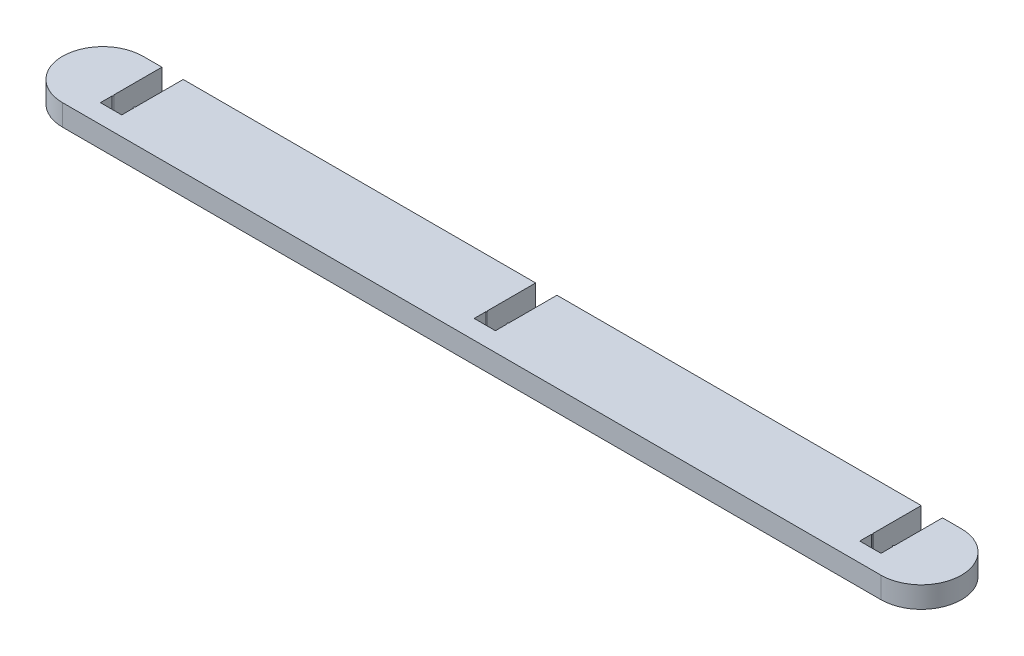
ISO-10303-21;
HEADER;
FILE_DESCRIPTION(('STEP AP214'),'2;1');
FILE_NAME('part.step','',(''),(''),'','','');
FILE_SCHEMA(('AUTOMOTIVE_DESIGN { 1 0 10303 214 1 1 1 1 }'));
ENDSEC;
DATA;
#1=APPLICATION_CONTEXT('core data for automotive mechanical design processes');
#2=APPLICATION_PROTOCOL_DEFINITION('international standard','automotive_design',2000,#1);
#3=PRODUCT_CONTEXT('',#1,'mechanical');
#4=PRODUCT('Part','Part','',(#3));
#5=PRODUCT_RELATED_PRODUCT_CATEGORY('part','',(#4));
#6=PRODUCT_DEFINITION_FORMATION('','',#4);
#7=PRODUCT_DEFINITION_CONTEXT('part definition',#1,'design');
#8=PRODUCT_DEFINITION('design','',#6,#7);
#9=PRODUCT_DEFINITION_SHAPE('','',#8);
#10=(LENGTH_UNIT() NAMED_UNIT(*) SI_UNIT(.MILLI.,.METRE.));
#11=(NAMED_UNIT(*) PLANE_ANGLE_UNIT() SI_UNIT($,.RADIAN.));
#12=(NAMED_UNIT(*) SI_UNIT($,.STERADIAN.) SOLID_ANGLE_UNIT());
#13=UNCERTAINTY_MEASURE_WITH_UNIT(LENGTH_MEASURE(1.E-05),#10,'distance_accuracy_value','');
#14=(GEOMETRIC_REPRESENTATION_CONTEXT(3) GLOBAL_UNCERTAINTY_ASSIGNED_CONTEXT((#13)) GLOBAL_UNIT_ASSIGNED_CONTEXT((#10,
#11,#12)) REPRESENTATION_CONTEXT('',''));
#15=CARTESIAN_POINT('',(0.,0.,0.));
#16=DIRECTION('',(0.,0.,1.));
#17=DIRECTION('',(1.,0.,0.));
#18=AXIS2_PLACEMENT_3D('',#15,#16,#17);
#19=CARTESIAN_POINT('',(-46.5788033490451,4.5,6.04739512254578));
#20=DIRECTION('',(0.,-1.,0.));
#21=DIRECTION('',(0.,0.,-1.));
#22=AXIS2_PLACEMENT_3D('',#19,#20,#21);
#23=CYLINDRICAL_SURFACE('',#22,8.5);
#24=CARTESIAN_POINT('',(-46.5788033490451,0.,6.04739512254578));
#25=DIRECTION('',(0.,1.,0.));
#26=DIRECTION('',(0.,0.,1.));
#27=AXIS2_PLACEMENT_3D('',#24,#25,#26);
#28=CIRCLE('',#27,8.5);
#29=CARTESIAN_POINT('',(-46.5788033490451,0.,-2.45260487745422));
#30=VERTEX_POINT('',#29);
#31=CARTESIAN_POINT('',(-46.5788033490451,0.,14.5473951225458));
#32=VERTEX_POINT('',#31);
#33=EDGE_CURVE('E248',#30,#32,#28,.T.);
#34=ORIENTED_EDGE('',*,*,#33,.T.);
#35=DIRECTION('',(0.,-1.,0.));
#36=VECTOR('',#35,1.);
#37=CARTESIAN_POINT('',(-46.5788033490451,4.5,14.5473951225458));
#38=LINE('',#37,#36);
#39=CARTESIAN_POINT('',(-46.5788033490451,4.5,14.5473951225458));
#40=VERTEX_POINT('',#39);
#41=EDGE_CURVE('E11',#40,#32,#38,.T.);
#42=ORIENTED_EDGE('',*,*,#41,.F.);
#43=CARTESIAN_POINT('',(-46.5788033490451,4.5,6.04739512254578));
#44=DIRECTION('',(0.,1.,0.));
#45=DIRECTION('',(0.,0.,1.));
#46=AXIS2_PLACEMENT_3D('',#43,#44,#45);
#47=CIRCLE('',#46,8.5);
#48=CARTESIAN_POINT('',(-46.5788033490451,4.5,-2.45260487745422));
#49=VERTEX_POINT('',#48);
#50=EDGE_CURVE('E304',#49,#40,#47,.T.);
#51=ORIENTED_EDGE('',*,*,#50,.F.);
#52=DIRECTION('',(0.,-1.,0.));
#53=VECTOR('',#52,1.);
#54=CARTESIAN_POINT('',(-46.5788033490451,4.5,-2.45260487745422));
#55=LINE('',#54,#53);
#56=EDGE_CURVE('E244',#49,#30,#55,.T.);
#57=ORIENTED_EDGE('',*,*,#56,.T.);
#58=EDGE_LOOP('',(#34,#42,#51,#57));
#59=FACE_BOUND('',#58,.T.);
#60=ADVANCED_FACE('F32',(#59),#23,.T.);
#61=CARTESIAN_POINT('',(-46.5788033490451,4.5,14.5473951225458));
#62=DIRECTION('',(0.,0.,-1.));
#63=DIRECTION('',(-1.,0.,0.));
#64=AXIS2_PLACEMENT_3D('',#61,#62,#63);
#65=PLANE('',#64);
#66=DIRECTION('',(1.,0.,0.));
#67=VECTOR('',#66,1.);
#68=CARTESIAN_POINT('',(-46.5788033490451,0.,14.5473951225458));
#69=LINE('',#68,#67);
#70=CARTESIAN_POINT('',(126.421196650955,0.,14.5473951225458));
#71=VERTEX_POINT('',#70);
#72=EDGE_CURVE('E251',#32,#71,#69,.T.);
#73=ORIENTED_EDGE('',*,*,#72,.T.);
#74=DIRECTION('',(0.,-1.,0.));
#75=VECTOR('',#74,1.);
#76=CARTESIAN_POINT('',(126.421196650955,4.5,14.5473951225458));
#77=LINE('',#76,#75);
#78=CARTESIAN_POINT('',(126.421196650955,4.5,14.5473951225458));
#79=VERTEX_POINT('',#78);
#80=EDGE_CURVE('E40',#79,#71,#77,.T.);
#81=ORIENTED_EDGE('',*,*,#80,.F.);
#82=DIRECTION('',(1.,0.,0.));
#83=VECTOR('',#82,1.);
#84=CARTESIAN_POINT('',(-46.5788033490451,4.5,14.5473951225458));
#85=LINE('',#84,#83);
#86=EDGE_CURVE('E151',#40,#79,#85,.T.);
#87=ORIENTED_EDGE('',*,*,#86,.F.);
#88=ORIENTED_EDGE('',*,*,#41,.T.);
#89=EDGE_LOOP('',(#73,#81,#87,#88));
#90=FACE_BOUND('',#89,.T.);
#91=ADVANCED_FACE('F462',(#90),#65,.F.);
#92=CARTESIAN_POINT('',(126.421196650955,4.5,6.04739512254578));
#93=DIRECTION('',(0.,-1.,0.));
#94=DIRECTION('',(0.,0.,-1.));
#95=AXIS2_PLACEMENT_3D('',#92,#93,#94);
#96=CYLINDRICAL_SURFACE('',#95,8.5);
#97=CARTESIAN_POINT('',(126.421196650955,0.,6.04739512254578));
#98=DIRECTION('',(0.,1.,0.));
#99=DIRECTION('',(0.,0.,-1.));
#100=AXIS2_PLACEMENT_3D('',#97,#98,#99);
#101=CIRCLE('',#100,8.5);
#102=CARTESIAN_POINT('',(126.421196650955,0.,-2.45260487745422));
#103=VERTEX_POINT('',#102);
#104=EDGE_CURVE('E253',#71,#103,#101,.T.);
#105=ORIENTED_EDGE('',*,*,#104,.T.);
#106=DIRECTION('',(0.,-1.,0.));
#107=VECTOR('',#106,1.);
#108=CARTESIAN_POINT('',(126.421196650955,4.5,-2.45260487745422));
#109=LINE('',#108,#107);
#110=CARTESIAN_POINT('',(126.421196650955,4.5,-2.45260487745422));
#111=VERTEX_POINT('',#110);
#112=EDGE_CURVE('E371',#111,#103,#109,.T.);
#113=ORIENTED_EDGE('',*,*,#112,.F.);
#114=CARTESIAN_POINT('',(126.421196650955,4.5,6.04739512254578));
#115=DIRECTION('',(0.,1.,0.));
#116=DIRECTION('',(0.,0.,-1.));
#117=AXIS2_PLACEMENT_3D('',#114,#115,#116);
#118=CIRCLE('',#117,8.5);
#119=EDGE_CURVE('E379',#79,#111,#118,.T.);
#120=ORIENTED_EDGE('',*,*,#119,.F.);
#121=ORIENTED_EDGE('',*,*,#80,.T.);
#122=EDGE_LOOP('',(#105,#113,#120,#121));
#123=FACE_BOUND('',#122,.T.);
#124=ADVANCED_FACE('F377',(#123),#96,.T.);
#125=CARTESIAN_POINT('',(122.421196650955,4.5,-2.45260487745422));
#126=DIRECTION('',(0.,0.,1.));
#127=DIRECTION('',(1.,0.,0.));
#128=AXIS2_PLACEMENT_3D('',#125,#126,#127);
#129=PLANE('',#128);
#130=DIRECTION('',(-1.,0.,0.));
#131=VECTOR('',#130,1.);
#132=CARTESIAN_POINT('',(122.421196650955,0.,-2.45260487745422));
#133=LINE('',#132,#131);
#134=CARTESIAN_POINT('',(122.421196650955,0.,-2.45260487745422));
#135=VERTEX_POINT('',#134);
#136=EDGE_CURVE('E255',#103,#135,#133,.T.);
#137=ORIENTED_EDGE('',*,*,#136,.T.);
#138=DIRECTION('',(0.,-1.,0.));
#139=VECTOR('',#138,1.);
#140=CARTESIAN_POINT('',(122.421196650955,4.5,-2.45260487745422));
#141=LINE('',#140,#139);
#142=CARTESIAN_POINT('',(122.421196650955,4.5,-2.45260487745422));
#143=VERTEX_POINT('',#142);
#144=EDGE_CURVE('E368',#143,#135,#141,.T.);
#145=ORIENTED_EDGE('',*,*,#144,.F.);
#146=DIRECTION('',(-1.,0.,0.));
#147=VECTOR('',#146,1.);
#148=CARTESIAN_POINT('',(122.421196650955,4.5,-2.45260487745422));
#149=LINE('',#148,#147);
#150=EDGE_CURVE('E397',#111,#143,#149,.T.);
#151=ORIENTED_EDGE('',*,*,#150,.F.);
#152=ORIENTED_EDGE('',*,*,#112,.T.);
#153=EDGE_LOOP('',(#137,#145,#151,#152));
#154=FACE_BOUND('',#153,.T.);
#155=ADVANCED_FACE('F388',(#154),#129,.F.);
#156=CARTESIAN_POINT('',(122.421196650955,4.5,-2.45260487745422));
#157=DIRECTION('',(1.,0.,0.));
#158=DIRECTION('',(0.,0.,-1.));
#159=AXIS2_PLACEMENT_3D('',#156,#157,#158);
#160=PLANE('',#159);
#161=DIRECTION('',(0.,0.,1.));
#162=VECTOR('',#161,1.);
#163=CARTESIAN_POINT('',(122.421196650955,0.,-2.45260487745422));
#164=LINE('',#163,#162);
#165=CARTESIAN_POINT('',(122.421196650955,0.,7.74248328202995));
#166=VERTEX_POINT('',#165);
#167=EDGE_CURVE('E257',#135,#166,#164,.T.);
#168=ORIENTED_EDGE('',*,*,#167,.T.);
#169=DIRECTION('',(0.,-1.,0.));
#170=VECTOR('',#169,1.);
#171=CARTESIAN_POINT('',(122.421196650955,4.5,7.74248328202995));
#172=LINE('',#171,#170);
#173=CARTESIAN_POINT('',(122.421196650955,4.5,7.74248328202995));
#174=VERTEX_POINT('',#173);
#175=EDGE_CURVE('E365',#174,#166,#172,.T.);
#176=ORIENTED_EDGE('',*,*,#175,.F.);
#177=DIRECTION('',(0.,0.,1.));
#178=VECTOR('',#177,1.);
#179=CARTESIAN_POINT('',(122.421196650955,4.5,-2.45260487745422));
#180=LINE('',#179,#178);
#181=EDGE_CURVE('E394',#143,#174,#180,.T.);
#182=ORIENTED_EDGE('',*,*,#181,.F.);
#183=ORIENTED_EDGE('',*,*,#144,.T.);
#184=EDGE_LOOP('',(#168,#176,#182,#183));
#185=FACE_BOUND('',#184,.T.);
#186=ADVANCED_FACE('F392',(#185),#160,.F.);
#187=CARTESIAN_POINT('',(122.421196650955,4.5,7.89493920228787));
#188=DIRECTION('',(0.,-1.,0.));
#189=DIRECTION('',(0.,0.,-1.));
#190=AXIS2_PLACEMENT_3D('',#187,#188,#189);
#191=CYLINDRICAL_SURFACE('',#190,0.152455920257921);
#192=CARTESIAN_POINT('',(122.421196650955,0.,7.89493920228787));
#193=DIRECTION('',(0.,1.,0.));
#194=DIRECTION('',(0.,0.,1.));
#195=AXIS2_PLACEMENT_3D('',#192,#193,#194);
#196=CIRCLE('',#195,0.152455920257921);
#197=CARTESIAN_POINT('',(122.421196650955,0.,8.04739512254579));
#198=VERTEX_POINT('',#197);
#199=EDGE_CURVE('E259',#166,#198,#196,.T.);
#200=ORIENTED_EDGE('',*,*,#199,.T.);
#201=DIRECTION('',(0.,-1.,0.));
#202=VECTOR('',#201,1.);
#203=CARTESIAN_POINT('',(122.421196650955,4.5,8.04739512254579));
#204=LINE('',#203,#202);
#205=CARTESIAN_POINT('',(122.421196650955,4.5,8.04739512254579));
#206=VERTEX_POINT('',#205);
#207=EDGE_CURVE('E362',#206,#198,#204,.T.);
#208=ORIENTED_EDGE('',*,*,#207,.F.);
#209=CARTESIAN_POINT('',(122.421196650955,4.5,7.89493920228787));
#210=DIRECTION('',(0.,1.,0.));
#211=DIRECTION('',(0.,0.,1.));
#212=AXIS2_PLACEMENT_3D('',#209,#210,#211);
#213=CIRCLE('',#212,0.152455920257921);
#214=EDGE_CURVE('E396',#174,#206,#213,.T.);
#215=ORIENTED_EDGE('',*,*,#214,.F.);
#216=ORIENTED_EDGE('',*,*,#175,.T.);
#217=EDGE_LOOP('',(#200,#208,#215,#216));
#218=FACE_BOUND('',#217,.T.);
#219=ADVANCED_FACE('F475',(#218),#191,.T.);
#220=CARTESIAN_POINT('',(122.421196650955,4.5,8.04739512254579));
#221=DIRECTION('',(1.,0.,0.));
#222=DIRECTION('',(0.,0.,-1.));
#223=AXIS2_PLACEMENT_3D('',#220,#221,#222);
#224=PLANE('',#223);
#225=DIRECTION('',(0.,0.,1.));
#226=VECTOR('',#225,1.);
#227=CARTESIAN_POINT('',(122.421196650955,0.,8.04739512254579));
#228=LINE('',#227,#226);
#229=CARTESIAN_POINT('',(122.421196650955,0.,10.5473951225458));
#230=VERTEX_POINT('',#229);
#231=EDGE_CURVE('E261',#198,#230,#228,.T.);
#232=ORIENTED_EDGE('',*,*,#231,.T.);
#233=DIRECTION('',(0.,-1.,0.));
#234=VECTOR('',#233,1.);
#235=CARTESIAN_POINT('',(122.421196650955,4.5,10.5473951225458));
#236=LINE('',#235,#234);
#237=CARTESIAN_POINT('',(122.421196650955,4.5,10.5473951225458));
#238=VERTEX_POINT('',#237);
#239=EDGE_CURVE('E359',#238,#230,#236,.T.);
#240=ORIENTED_EDGE('',*,*,#239,.F.);
#241=DIRECTION('',(0.,0.,1.));
#242=VECTOR('',#241,1.);
#243=CARTESIAN_POINT('',(122.421196650955,4.5,8.04739512254579));
#244=LINE('',#243,#242);
#245=EDGE_CURVE('E399',#206,#238,#244,.T.);
#246=ORIENTED_EDGE('',*,*,#245,.F.);
#247=ORIENTED_EDGE('',*,*,#207,.T.);
#248=EDGE_LOOP('',(#232,#240,#246,#247));
#249=FACE_BOUND('',#248,.T.);
#250=ADVANCED_FACE('F478',(#249),#224,.F.);
#251=CARTESIAN_POINT('',(117.921196650955,4.5,10.5473951225458));
#252=DIRECTION('',(0.,0.,1.));
#253=DIRECTION('',(1.,0.,0.));
#254=AXIS2_PLACEMENT_3D('',#251,#252,#253);
#255=PLANE('',#254);
#256=DIRECTION('',(-1.,0.,0.));
#257=VECTOR('',#256,1.);
#258=CARTESIAN_POINT('',(117.921196650955,0.,10.5473951225458));
#259=LINE('',#258,#257);
#260=CARTESIAN_POINT('',(117.921196650955,0.,10.5473951225458));
#261=VERTEX_POINT('',#260);
#262=EDGE_CURVE('E263',#230,#261,#259,.T.);
#263=ORIENTED_EDGE('',*,*,#262,.T.);
#264=DIRECTION('',(0.,-1.,0.));
#265=VECTOR('',#264,1.);
#266=CARTESIAN_POINT('',(117.921196650955,4.5,10.5473951225458));
#267=LINE('',#266,#265);
#268=CARTESIAN_POINT('',(117.921196650955,4.5,10.5473951225458));
#269=VERTEX_POINT('',#268);
#270=EDGE_CURVE('E356',#269,#261,#267,.T.);
#271=ORIENTED_EDGE('',*,*,#270,.F.);
#272=DIRECTION('',(-1.,0.,0.));
#273=VECTOR('',#272,1.);
#274=CARTESIAN_POINT('',(117.921196650955,4.5,10.5473951225458));
#275=LINE('',#274,#273);
#276=EDGE_CURVE('E405',#238,#269,#275,.T.);
#277=ORIENTED_EDGE('',*,*,#276,.F.);
#278=ORIENTED_EDGE('',*,*,#239,.T.);
#279=EDGE_LOOP('',(#263,#271,#277,#278));
#280=FACE_BOUND('',#279,.T.);
#281=ADVANCED_FACE('F482',(#280),#255,.F.);
#282=CARTESIAN_POINT('',(117.921196650955,4.5,8.04739512254579));
#283=DIRECTION('',(-1.,0.,0.));
#284=DIRECTION('',(0.,0.,1.));
#285=AXIS2_PLACEMENT_3D('',#282,#283,#284);
#286=PLANE('',#285);
#287=DIRECTION('',(0.,0.,-1.));
#288=VECTOR('',#287,1.);
#289=CARTESIAN_POINT('',(117.921196650955,0.,8.04739512254579));
#290=LINE('',#289,#288);
#291=CARTESIAN_POINT('',(117.921196650955,0.,8.04739512254579));
#292=VERTEX_POINT('',#291);
#293=EDGE_CURVE('E265',#261,#292,#290,.T.);
#294=ORIENTED_EDGE('',*,*,#293,.T.);
#295=DIRECTION('',(0.,-1.,0.));
#296=VECTOR('',#295,1.);
#297=CARTESIAN_POINT('',(117.921196650955,4.5,8.04739512254579));
#298=LINE('',#297,#296);
#299=CARTESIAN_POINT('',(117.921196650955,4.5,8.04739512254579));
#300=VERTEX_POINT('',#299);
#301=EDGE_CURVE('E353',#300,#292,#298,.T.);
#302=ORIENTED_EDGE('',*,*,#301,.F.);
#303=DIRECTION('',(0.,0.,-1.));
#304=VECTOR('',#303,1.);
#305=CARTESIAN_POINT('',(117.921196650955,4.5,8.04739512254579));
#306=LINE('',#305,#304);
#307=EDGE_CURVE('E407',#269,#300,#306,.T.);
#308=ORIENTED_EDGE('',*,*,#307,.F.);
#309=ORIENTED_EDGE('',*,*,#270,.T.);
#310=EDGE_LOOP('',(#294,#302,#308,#309));
#311=FACE_BOUND('',#310,.T.);
#312=ADVANCED_FACE('F486',(#311),#286,.F.);
#313=CARTESIAN_POINT('',(117.921196650955,4.5,7.89938377587726));
#314=DIRECTION('',(0.,-1.,0.));
#315=DIRECTION('',(0.,0.,-1.));
#316=AXIS2_PLACEMENT_3D('',#313,#314,#315);
#317=CYLINDRICAL_SURFACE('',#316,0.148011346668524);
#318=CARTESIAN_POINT('',(117.921196650955,0.,7.89938377587726));
#319=DIRECTION('',(0.,1.,0.));
#320=DIRECTION('',(0.,0.,-1.));
#321=AXIS2_PLACEMENT_3D('',#318,#319,#320);
#322=CIRCLE('',#321,0.148011346668524);
#323=CARTESIAN_POINT('',(117.921196650955,0.,7.75137242920874));
#324=VERTEX_POINT('',#323);
#325=EDGE_CURVE('E267',#292,#324,#322,.T.);
#326=ORIENTED_EDGE('',*,*,#325,.T.);
#327=DIRECTION('',(0.,-1.,0.));
#328=VECTOR('',#327,1.);
#329=CARTESIAN_POINT('',(117.921196650955,4.5,7.75137242920874));
#330=LINE('',#329,#328);
#331=CARTESIAN_POINT('',(117.921196650955,4.5,7.75137242920874));
#332=VERTEX_POINT('',#331);
#333=EDGE_CURVE('E350',#332,#324,#330,.T.);
#334=ORIENTED_EDGE('',*,*,#333,.F.);
#335=CARTESIAN_POINT('',(117.921196650955,4.5,7.89938377587726));
#336=DIRECTION('',(0.,1.,0.));
#337=DIRECTION('',(0.,0.,-1.));
#338=AXIS2_PLACEMENT_3D('',#335,#336,#337);
#339=CIRCLE('',#338,0.148011346668524);
#340=EDGE_CURVE('E409',#300,#332,#339,.T.);
#341=ORIENTED_EDGE('',*,*,#340,.F.);
#342=ORIENTED_EDGE('',*,*,#301,.T.);
#343=EDGE_LOOP('',(#326,#334,#341,#342));
#344=FACE_BOUND('',#343,.T.);
#345=ADVANCED_FACE('F490',(#344),#317,.T.);
#346=CARTESIAN_POINT('',(117.921196650955,4.5,-2.45260487745422));
#347=DIRECTION('',(-1.,0.,0.));
#348=DIRECTION('',(0.,0.,1.));
#349=AXIS2_PLACEMENT_3D('',#346,#347,#348);
#350=PLANE('',#349);
#351=DIRECTION('',(0.,0.,-1.));
#352=VECTOR('',#351,1.);
#353=CARTESIAN_POINT('',(117.921196650955,0.,-2.45260487745422));
#354=LINE('',#353,#352);
#355=CARTESIAN_POINT('',(117.921196650955,0.,-2.45260487745422));
#356=VERTEX_POINT('',#355);
#357=EDGE_CURVE('E269',#324,#356,#354,.T.);
#358=ORIENTED_EDGE('',*,*,#357,.T.);
#359=DIRECTION('',(0.,-1.,0.));
#360=VECTOR('',#359,1.);
#361=CARTESIAN_POINT('',(117.921196650955,4.5,-2.45260487745422));
#362=LINE('',#361,#360);
#363=CARTESIAN_POINT('',(117.921196650955,4.5,-2.45260487745422));
#364=VERTEX_POINT('',#363);
#365=EDGE_CURVE('E347',#364,#356,#362,.T.);
#366=ORIENTED_EDGE('',*,*,#365,.F.);
#367=DIRECTION('',(0.,0.,-1.));
#368=VECTOR('',#367,1.);
#369=CARTESIAN_POINT('',(117.921196650955,4.5,-2.45260487745422));
#370=LINE('',#369,#368);
#371=EDGE_CURVE('E411',#332,#364,#370,.T.);
#372=ORIENTED_EDGE('',*,*,#371,.F.);
#373=ORIENTED_EDGE('',*,*,#333,.T.);
#374=EDGE_LOOP('',(#358,#366,#372,#373));
#375=FACE_BOUND('',#374,.T.);
#376=ADVANCED_FACE('F494',(#375),#350,.F.);
#377=CARTESIAN_POINT('',(40.9211966509549,4.5,-2.45260487745422));
#378=DIRECTION('',(0.,0.,1.));
#379=DIRECTION('',(1.,0.,0.));
#380=AXIS2_PLACEMENT_3D('',#377,#378,#379);
#381=PLANE('',#380);
#382=DIRECTION('',(-1.,0.,0.));
#383=VECTOR('',#382,1.);
#384=CARTESIAN_POINT('',(40.9211966509549,0.,-2.45260487745422));
#385=LINE('',#384,#383);
#386=CARTESIAN_POINT('',(40.9211966509549,0.,-2.45260487745422));
#387=VERTEX_POINT('',#386);
#388=EDGE_CURVE('E272',#356,#387,#385,.T.);
#389=ORIENTED_EDGE('',*,*,#388,.T.);
#390=DIRECTION('',(0.,-1.,0.));
#391=VECTOR('',#390,1.);
#392=CARTESIAN_POINT('',(40.9211966509549,4.5,-2.45260487745422));
#393=LINE('',#392,#391);
#394=CARTESIAN_POINT('',(40.9211966509549,4.5,-2.45260487745422));
#395=VERTEX_POINT('',#394);
#396=EDGE_CURVE('E344',#395,#387,#393,.T.);
#397=ORIENTED_EDGE('',*,*,#396,.F.);
#398=DIRECTION('',(-1.,0.,0.));
#399=VECTOR('',#398,1.);
#400=CARTESIAN_POINT('',(87.9211966509549,4.5,-2.45260487745422));
#401=LINE('',#400,#399);
#402=EDGE_CURVE('E413',#364,#395,#401,.T.);
#403=ORIENTED_EDGE('',*,*,#402,.F.);
#404=ORIENTED_EDGE('',*,*,#365,.T.);
#405=EDGE_LOOP('',(#389,#397,#403,#404));
#406=FACE_BOUND('',#405,.T.);
#407=ADVANCED_FACE('F498',(#406),#381,.F.);
#408=CARTESIAN_POINT('',(40.9211966509549,4.5,-2.45260487745422));
#409=DIRECTION('',(1.,0.,0.));
#410=DIRECTION('',(0.,0.,-1.));
#411=AXIS2_PLACEMENT_3D('',#408,#409,#410);
#412=PLANE('',#411);
#413=DIRECTION('',(0.,0.,1.));
#414=VECTOR('',#413,1.);
#415=CARTESIAN_POINT('',(40.9211966509549,0.,-2.45260487745422));
#416=LINE('',#415,#414);
#417=CARTESIAN_POINT('',(40.9211966509549,0.,7.7476696944967));
#418=VERTEX_POINT('',#417);
#419=EDGE_CURVE('E274',#387,#418,#416,.T.);
#420=ORIENTED_EDGE('',*,*,#419,.T.);
#421=DIRECTION('',(0.,-1.,0.));
#422=VECTOR('',#421,1.);
#423=CARTESIAN_POINT('',(40.9211966509549,4.5,7.7476696944967));
#424=LINE('',#423,#422);
#425=CARTESIAN_POINT('',(40.9211966509549,4.5,7.7476696944967));
#426=VERTEX_POINT('',#425);
#427=EDGE_CURVE('E341',#426,#418,#424,.T.);
#428=ORIENTED_EDGE('',*,*,#427,.F.);
#429=DIRECTION('',(0.,0.,1.));
#430=VECTOR('',#429,1.);
#431=CARTESIAN_POINT('',(40.9211966509549,4.5,-2.45260487745422));
#432=LINE('',#431,#430);
#433=EDGE_CURVE('E415',#395,#426,#432,.T.);
#434=ORIENTED_EDGE('',*,*,#433,.F.);
#435=ORIENTED_EDGE('',*,*,#396,.T.);
#436=EDGE_LOOP('',(#420,#428,#434,#435));
#437=FACE_BOUND('',#436,.T.);
#438=ADVANCED_FACE('F502',(#437),#412,.F.);
#439=CARTESIAN_POINT('',(40.9211966509549,4.5,7.89753240852124));
#440=DIRECTION('',(0.,-1.,0.));
#441=DIRECTION('',(0.,0.,-1.));
#442=AXIS2_PLACEMENT_3D('',#439,#440,#441);
#443=CYLINDRICAL_SURFACE('',#442,0.149862714024545);
#444=CARTESIAN_POINT('',(40.9211966509549,0.,7.89753240852124));
#445=DIRECTION('',(0.,1.,0.));
#446=DIRECTION('',(0.,0.,1.));
#447=AXIS2_PLACEMENT_3D('',#444,#445,#446);
#448=CIRCLE('',#447,0.149862714024545);
#449=CARTESIAN_POINT('',(40.9211966509549,0.,8.04739512254579));
#450=VERTEX_POINT('',#449);
#451=EDGE_CURVE('E276',#418,#450,#448,.T.);
#452=ORIENTED_EDGE('',*,*,#451,.T.);
#453=DIRECTION('',(0.,-1.,0.));
#454=VECTOR('',#453,1.);
#455=CARTESIAN_POINT('',(40.9211966509549,4.5,8.04739512254579));
#456=LINE('',#455,#454);
#457=CARTESIAN_POINT('',(40.9211966509549,4.5,8.04739512254579));
#458=VERTEX_POINT('',#457);
#459=EDGE_CURVE('E338',#458,#450,#456,.T.);
#460=ORIENTED_EDGE('',*,*,#459,.F.);
#461=CARTESIAN_POINT('',(40.9211966509549,4.5,7.89753240852124));
#462=DIRECTION('',(0.,1.,0.));
#463=DIRECTION('',(0.,0.,1.));
#464=AXIS2_PLACEMENT_3D('',#461,#462,#463);
#465=CIRCLE('',#464,0.149862714024545);
#466=EDGE_CURVE('E417',#426,#458,#465,.T.);
#467=ORIENTED_EDGE('',*,*,#466,.F.);
#468=ORIENTED_EDGE('',*,*,#427,.T.);
#469=EDGE_LOOP('',(#452,#460,#467,#468));
#470=FACE_BOUND('',#469,.T.);
#471=ADVANCED_FACE('F506',(#470),#443,.T.);
#472=CARTESIAN_POINT('',(40.9211966509549,4.5,8.04739512254579));
#473=DIRECTION('',(1.,0.,0.));
#474=DIRECTION('',(0.,0.,-1.));
#475=AXIS2_PLACEMENT_3D('',#472,#473,#474);
#476=PLANE('',#475);
#477=DIRECTION('',(0.,0.,1.));
#478=VECTOR('',#477,1.);
#479=CARTESIAN_POINT('',(40.9211966509549,0.,8.04739512254579));
#480=LINE('',#479,#478);
#481=CARTESIAN_POINT('',(40.9211966509549,0.,10.5473951225458));
#482=VERTEX_POINT('',#481);
#483=EDGE_CURVE('E278',#450,#482,#480,.T.);
#484=ORIENTED_EDGE('',*,*,#483,.T.);
#485=DIRECTION('',(0.,-1.,0.));
#486=VECTOR('',#485,1.);
#487=CARTESIAN_POINT('',(40.9211966509549,4.5,10.5473951225458));
#488=LINE('',#487,#486);
#489=CARTESIAN_POINT('',(40.9211966509549,4.5,10.5473951225458));
#490=VERTEX_POINT('',#489);
#491=EDGE_CURVE('E335',#490,#482,#488,.T.);
#492=ORIENTED_EDGE('',*,*,#491,.F.);
#493=DIRECTION('',(0.,0.,1.));
#494=VECTOR('',#493,1.);
#495=CARTESIAN_POINT('',(40.9211966509549,4.5,8.04739512254579));
#496=LINE('',#495,#494);
#497=EDGE_CURVE('E419',#458,#490,#496,.T.);
#498=ORIENTED_EDGE('',*,*,#497,.F.);
#499=ORIENTED_EDGE('',*,*,#459,.T.);
#500=EDGE_LOOP('',(#484,#492,#498,#499));
#501=FACE_BOUND('',#500,.T.);
#502=ADVANCED_FACE('F510',(#501),#476,.F.);
#503=CARTESIAN_POINT('',(36.4211966509549,4.5,10.5473951225458));
#504=DIRECTION('',(0.,0.,1.));
#505=DIRECTION('',(1.,0.,0.));
#506=AXIS2_PLACEMENT_3D('',#503,#504,#505);
#507=PLANE('',#506);
#508=DIRECTION('',(-1.,0.,0.));
#509=VECTOR('',#508,1.);
#510=CARTESIAN_POINT('',(36.4211966509549,0.,10.5473951225458));
#511=LINE('',#510,#509);
#512=CARTESIAN_POINT('',(36.4211966509549,0.,10.5473951225458));
#513=VERTEX_POINT('',#512);
#514=EDGE_CURVE('E280',#482,#513,#511,.T.);
#515=ORIENTED_EDGE('',*,*,#514,.T.);
#516=DIRECTION('',(0.,-1.,0.));
#517=VECTOR('',#516,1.);
#518=CARTESIAN_POINT('',(36.4211966509549,4.5,10.5473951225458));
#519=LINE('',#518,#517);
#520=CARTESIAN_POINT('',(36.4211966509549,4.5,10.5473951225458));
#521=VERTEX_POINT('',#520);
#522=EDGE_CURVE('E332',#521,#513,#519,.T.);
#523=ORIENTED_EDGE('',*,*,#522,.F.);
#524=DIRECTION('',(-1.,0.,0.));
#525=VECTOR('',#524,1.);
#526=CARTESIAN_POINT('',(36.4211966509549,4.5,10.5473951225458));
#527=LINE('',#526,#525);
#528=EDGE_CURVE('E421',#490,#521,#527,.T.);
#529=ORIENTED_EDGE('',*,*,#528,.F.);
#530=ORIENTED_EDGE('',*,*,#491,.T.);
#531=EDGE_LOOP('',(#515,#523,#529,#530));
#532=FACE_BOUND('',#531,.T.);
#533=ADVANCED_FACE('F514',(#532),#507,.F.);
#534=CARTESIAN_POINT('',(36.4211966509549,4.5,8.04739512254579));
#535=DIRECTION('',(-1.,0.,0.));
#536=DIRECTION('',(0.,0.,1.));
#537=AXIS2_PLACEMENT_3D('',#534,#535,#536);
#538=PLANE('',#537);
#539=DIRECTION('',(0.,0.,-1.));
#540=VECTOR('',#539,1.);
#541=CARTESIAN_POINT('',(36.4211966509549,0.,8.04739512254579));
#542=LINE('',#541,#540);
#543=CARTESIAN_POINT('',(36.4211966509549,0.,8.04739512254579));
#544=VERTEX_POINT('',#543);
#545=EDGE_CURVE('E282',#513,#544,#542,.T.);
#546=ORIENTED_EDGE('',*,*,#545,.T.);
#547=DIRECTION('',(0.,-1.,0.));
#548=VECTOR('',#547,1.);
#549=CARTESIAN_POINT('',(36.4211966509549,4.5,8.04739512254579));
#550=LINE('',#549,#548);
#551=CARTESIAN_POINT('',(36.4211966509549,4.5,8.04739512254579));
#552=VERTEX_POINT('',#551);
#553=EDGE_CURVE('E329',#552,#544,#550,.T.);
#554=ORIENTED_EDGE('',*,*,#553,.F.);
#555=DIRECTION('',(0.,0.,-1.));
#556=VECTOR('',#555,1.);
#557=CARTESIAN_POINT('',(36.4211966509549,4.5,8.04739512254579));
#558=LINE('',#557,#556);
#559=EDGE_CURVE('E423',#521,#552,#558,.T.);
#560=ORIENTED_EDGE('',*,*,#559,.F.);
#561=ORIENTED_EDGE('',*,*,#522,.T.);
#562=EDGE_LOOP('',(#546,#554,#560,#561));
#563=FACE_BOUND('',#562,.T.);
#564=ADVANCED_FACE('F518',(#563),#538,.F.);
#565=CARTESIAN_POINT('',(36.4211966509549,4.5,7.89753240852124));
#566=DIRECTION('',(0.,-1.,0.));
#567=DIRECTION('',(0.,0.,-1.));
#568=AXIS2_PLACEMENT_3D('',#565,#566,#567);
#569=CYLINDRICAL_SURFACE('',#568,0.149862714024545);
#570=CARTESIAN_POINT('',(36.4211966509549,0.,7.89753240852124));
#571=DIRECTION('',(0.,1.,0.));
#572=DIRECTION('',(0.,0.,1.));
#573=AXIS2_PLACEMENT_3D('',#570,#571,#572);
#574=CIRCLE('',#573,0.149862714024545);
#575=CARTESIAN_POINT('',(36.4211966509549,0.,7.7476696944967));
#576=VERTEX_POINT('',#575);
#577=EDGE_CURVE('E284',#544,#576,#574,.T.);
#578=ORIENTED_EDGE('',*,*,#577,.T.);
#579=DIRECTION('',(0.,-1.,0.));
#580=VECTOR('',#579,1.);
#581=CARTESIAN_POINT('',(36.4211966509549,4.5,7.7476696944967));
#582=LINE('',#581,#580);
#583=CARTESIAN_POINT('',(36.4211966509549,4.5,7.7476696944967));
#584=VERTEX_POINT('',#583);
#585=EDGE_CURVE('E326',#584,#576,#582,.T.);
#586=ORIENTED_EDGE('',*,*,#585,.F.);
#587=CARTESIAN_POINT('',(36.4211966509549,4.5,7.89753240852124));
#588=DIRECTION('',(0.,1.,0.));
#589=DIRECTION('',(0.,0.,1.));
#590=AXIS2_PLACEMENT_3D('',#587,#588,#589);
#591=CIRCLE('',#590,0.149862714024545);
#592=EDGE_CURVE('E425',#552,#584,#591,.T.);
#593=ORIENTED_EDGE('',*,*,#592,.F.);
#594=ORIENTED_EDGE('',*,*,#553,.T.);
#595=EDGE_LOOP('',(#578,#586,#593,#594));
#596=FACE_BOUND('',#595,.T.);
#597=ADVANCED_FACE('F522',(#596),#569,.T.);
#598=CARTESIAN_POINT('',(36.4211966509549,4.5,-2.45260487745422));
#599=DIRECTION('',(-1.,0.,0.));
#600=DIRECTION('',(0.,0.,1.));
#601=AXIS2_PLACEMENT_3D('',#598,#599,#600);
#602=PLANE('',#601);
#603=DIRECTION('',(0.,0.,-1.));
#604=VECTOR('',#603,1.);
#605=CARTESIAN_POINT('',(36.4211966509549,0.,-2.45260487745422));
#606=LINE('',#605,#604);
#607=CARTESIAN_POINT('',(36.4211966509549,0.,-2.45260487745422));
#608=VERTEX_POINT('',#607);
#609=EDGE_CURVE('E286',#576,#608,#606,.T.);
#610=ORIENTED_EDGE('',*,*,#609,.T.);
#611=DIRECTION('',(0.,-1.,0.));
#612=VECTOR('',#611,1.);
#613=CARTESIAN_POINT('',(36.4211966509549,4.5,-2.45260487745422));
#614=LINE('',#613,#612);
#615=CARTESIAN_POINT('',(36.4211966509549,4.5,-2.45260487745422));
#616=VERTEX_POINT('',#615);
#617=EDGE_CURVE('E323',#616,#608,#614,.T.);
#618=ORIENTED_EDGE('',*,*,#617,.F.);
#619=DIRECTION('',(0.,0.,-1.));
#620=VECTOR('',#619,1.);
#621=CARTESIAN_POINT('',(36.4211966509549,4.5,-2.45260487745422));
#622=LINE('',#621,#620);
#623=EDGE_CURVE('E427',#584,#616,#622,.T.);
#624=ORIENTED_EDGE('',*,*,#623,.F.);
#625=ORIENTED_EDGE('',*,*,#585,.T.);
#626=EDGE_LOOP('',(#610,#618,#624,#625));
#627=FACE_BOUND('',#626,.T.);
#628=ADVANCED_FACE('F526',(#627),#602,.F.);
#629=CARTESIAN_POINT('',(-38.0788033490451,4.5,-2.45260487745422));
#630=DIRECTION('',(0.,0.,1.));
#631=DIRECTION('',(1.,0.,0.));
#632=AXIS2_PLACEMENT_3D('',#629,#630,#631);
#633=PLANE('',#632);
#634=DIRECTION('',(-1.,0.,0.));
#635=VECTOR('',#634,1.);
#636=CARTESIAN_POINT('',(-38.0788033490451,0.,-2.45260487745422));
#637=LINE('',#636,#635);
#638=CARTESIAN_POINT('',(-38.0788033490451,0.,-2.45260487745422));
#639=VERTEX_POINT('',#638);
#640=EDGE_CURVE('E289',#608,#639,#637,.T.);
#641=ORIENTED_EDGE('',*,*,#640,.T.);
#642=DIRECTION('',(0.,-1.,0.));
#643=VECTOR('',#642,1.);
#644=CARTESIAN_POINT('',(-38.0788033490451,4.5,-2.45260487745422));
#645=LINE('',#644,#643);
#646=CARTESIAN_POINT('',(-38.0788033490451,4.5,-2.45260487745422));
#647=VERTEX_POINT('',#646);
#648=EDGE_CURVE('E320',#647,#639,#645,.T.);
#649=ORIENTED_EDGE('',*,*,#648,.F.);
#650=DIRECTION('',(-1.,0.,0.));
#651=VECTOR('',#650,1.);
#652=CARTESIAN_POINT('',(-3.5788033490451,4.5,-2.45260487745422));
#653=LINE('',#652,#651);
#654=EDGE_CURVE('E429',#616,#647,#653,.T.);
#655=ORIENTED_EDGE('',*,*,#654,.F.);
#656=ORIENTED_EDGE('',*,*,#617,.T.);
#657=EDGE_LOOP('',(#641,#649,#655,#656));
#658=FACE_BOUND('',#657,.T.);
#659=ADVANCED_FACE('F530',(#658),#633,.F.);
#660=CARTESIAN_POINT('',(-38.0788033490451,4.5,-2.45260487745422));
#661=DIRECTION('',(1.,0.,0.));
#662=DIRECTION('',(0.,0.,-1.));
#663=AXIS2_PLACEMENT_3D('',#660,#661,#662);
#664=PLANE('',#663);
#665=DIRECTION('',(0.,0.,1.));
#666=VECTOR('',#665,1.);
#667=CARTESIAN_POINT('',(-38.0788033490451,0.,-2.45260487745422));
#668=LINE('',#667,#666);
#669=CARTESIAN_POINT('',(-38.0788033490451,0.,7.7493992479419));
#670=VERTEX_POINT('',#669);
#671=EDGE_CURVE('E291',#639,#670,#668,.T.);
#672=ORIENTED_EDGE('',*,*,#671,.T.);
#673=DIRECTION('',(0.,-1.,0.));
#674=VECTOR('',#673,1.);
#675=CARTESIAN_POINT('',(-38.0788033490451,4.5,7.7493992479419));
#676=LINE('',#675,#674);
#677=CARTESIAN_POINT('',(-38.0788033490451,4.5,7.7493992479419));
#678=VERTEX_POINT('',#677);
#679=EDGE_CURVE('E317',#678,#670,#676,.T.);
#680=ORIENTED_EDGE('',*,*,#679,.F.);
#681=DIRECTION('',(0.,0.,1.));
#682=VECTOR('',#681,1.);
#683=CARTESIAN_POINT('',(-38.0788033490451,4.5,-2.45260487745422));
#684=LINE('',#683,#682);
#685=EDGE_CURVE('E431',#647,#678,#684,.T.);
#686=ORIENTED_EDGE('',*,*,#685,.F.);
#687=ORIENTED_EDGE('',*,*,#648,.T.);
#688=EDGE_LOOP('',(#672,#680,#686,#687));
#689=FACE_BOUND('',#688,.T.);
#690=ADVANCED_FACE('F534',(#689),#664,.F.);
#691=CARTESIAN_POINT('',(-38.0788033490451,4.5,7.89839718524384));
#692=DIRECTION('',(0.,-1.,0.));
#693=DIRECTION('',(0.,0.,-1.));
#694=AXIS2_PLACEMENT_3D('',#691,#692,#693);
#695=CYLINDRICAL_SURFACE('',#694,0.148997937301942);
#696=CARTESIAN_POINT('',(-38.0788033490451,0.,7.89839718524384));
#697=DIRECTION('',(0.,1.,0.));
#698=DIRECTION('',(0.,0.,1.));
#699=AXIS2_PLACEMENT_3D('',#696,#697,#698);
#700=CIRCLE('',#699,0.148997937301942);
#701=CARTESIAN_POINT('',(-38.0788033490451,0.,8.04739512254579));
#702=VERTEX_POINT('',#701);
#703=EDGE_CURVE('E293',#670,#702,#700,.T.);
#704=ORIENTED_EDGE('',*,*,#703,.T.);
#705=DIRECTION('',(0.,-1.,0.));
#706=VECTOR('',#705,1.);
#707=CARTESIAN_POINT('',(-38.0788033490451,4.5,8.04739512254579));
#708=LINE('',#707,#706);
#709=CARTESIAN_POINT('',(-38.0788033490451,4.5,8.04739512254579));
#710=VERTEX_POINT('',#709);
#711=EDGE_CURVE('E314',#710,#702,#708,.T.);
#712=ORIENTED_EDGE('',*,*,#711,.F.);
#713=CARTESIAN_POINT('',(-38.0788033490451,4.5,7.89839718524384));
#714=DIRECTION('',(0.,1.,0.));
#715=DIRECTION('',(0.,0.,1.));
#716=AXIS2_PLACEMENT_3D('',#713,#714,#715);
#717=CIRCLE('',#716,0.148997937301942);
#718=EDGE_CURVE('E433',#678,#710,#717,.T.);
#719=ORIENTED_EDGE('',*,*,#718,.F.);
#720=ORIENTED_EDGE('',*,*,#679,.T.);
#721=EDGE_LOOP('',(#704,#712,#719,#720));
#722=FACE_BOUND('',#721,.T.);
#723=ADVANCED_FACE('F538',(#722),#695,.T.);
#724=CARTESIAN_POINT('',(-38.0788033490451,4.5,8.04739512254579));
#725=DIRECTION('',(1.,0.,0.));
#726=DIRECTION('',(0.,0.,-1.));
#727=AXIS2_PLACEMENT_3D('',#724,#725,#726);
#728=PLANE('',#727);
#729=DIRECTION('',(0.,0.,1.));
#730=VECTOR('',#729,1.);
#731=CARTESIAN_POINT('',(-38.0788033490451,0.,8.04739512254579));
#732=LINE('',#731,#730);
#733=CARTESIAN_POINT('',(-38.0788033490451,0.,10.5473951225458));
#734=VERTEX_POINT('',#733);
#735=EDGE_CURVE('E295',#702,#734,#732,.T.);
#736=ORIENTED_EDGE('',*,*,#735,.T.);
#737=DIRECTION('',(0.,-1.,0.));
#738=VECTOR('',#737,1.);
#739=CARTESIAN_POINT('',(-38.0788033490451,4.5,10.5473951225458));
#740=LINE('',#739,#738);
#741=CARTESIAN_POINT('',(-38.0788033490451,4.5,10.5473951225458));
#742=VERTEX_POINT('',#741);
#743=EDGE_CURVE('E311',#742,#734,#740,.T.);
#744=ORIENTED_EDGE('',*,*,#743,.F.);
#745=DIRECTION('',(0.,0.,1.));
#746=VECTOR('',#745,1.);
#747=CARTESIAN_POINT('',(-38.0788033490451,4.5,8.04739512254579));
#748=LINE('',#747,#746);
#749=EDGE_CURVE('E435',#710,#742,#748,.T.);
#750=ORIENTED_EDGE('',*,*,#749,.F.);
#751=ORIENTED_EDGE('',*,*,#711,.T.);
#752=EDGE_LOOP('',(#736,#744,#750,#751));
#753=FACE_BOUND('',#752,.T.);
#754=ADVANCED_FACE('F542',(#753),#728,.F.);
#755=CARTESIAN_POINT('',(-42.5788033490451,4.5,10.5473951225458));
#756=DIRECTION('',(0.,0.,1.));
#757=DIRECTION('',(1.,0.,0.));
#758=AXIS2_PLACEMENT_3D('',#755,#756,#757);
#759=PLANE('',#758);
#760=DIRECTION('',(-1.,0.,0.));
#761=VECTOR('',#760,1.);
#762=CARTESIAN_POINT('',(-42.5788033490451,0.,10.5473951225458));
#763=LINE('',#762,#761);
#764=CARTESIAN_POINT('',(-42.5788033490451,0.,10.5473951225458));
#765=VERTEX_POINT('',#764);
#766=EDGE_CURVE('E297',#734,#765,#763,.T.);
#767=ORIENTED_EDGE('',*,*,#766,.T.);
#768=DIRECTION('',(0.,-1.,0.));
#769=VECTOR('',#768,1.);
#770=CARTESIAN_POINT('',(-42.5788033490451,4.5,10.5473951225458));
#771=LINE('',#770,#769);
#772=CARTESIAN_POINT('',(-42.5788033490451,4.5,10.5473951225458));
#773=VERTEX_POINT('',#772);
#774=EDGE_CURVE('E308',#773,#765,#771,.T.);
#775=ORIENTED_EDGE('',*,*,#774,.F.);
#776=DIRECTION('',(-1.,0.,0.));
#777=VECTOR('',#776,1.);
#778=CARTESIAN_POINT('',(-42.5788033490451,4.5,10.5473951225458));
#779=LINE('',#778,#777);
#780=EDGE_CURVE('E437',#742,#773,#779,.T.);
#781=ORIENTED_EDGE('',*,*,#780,.F.);
#782=ORIENTED_EDGE('',*,*,#743,.T.);
#783=EDGE_LOOP('',(#767,#775,#781,#782));
#784=FACE_BOUND('',#783,.T.);
#785=ADVANCED_FACE('F443',(#784),#759,.F.);
#786=CARTESIAN_POINT('',(-42.5788033490451,4.5,8.04739512254579));
#787=DIRECTION('',(-1.,0.,0.));
#788=DIRECTION('',(0.,0.,1.));
#789=AXIS2_PLACEMENT_3D('',#786,#787,#788);
#790=PLANE('',#789);
#791=DIRECTION('',(0.,0.,-1.));
#792=VECTOR('',#791,1.);
#793=CARTESIAN_POINT('',(-42.5788033490451,0.,8.04739512254579));
#794=LINE('',#793,#792);
#795=CARTESIAN_POINT('',(-42.5788033490451,0.,8.04739512254579));
#796=VERTEX_POINT('',#795);
#797=EDGE_CURVE('E299',#765,#796,#794,.T.);
#798=ORIENTED_EDGE('',*,*,#797,.T.);
#799=DIRECTION('',(0.,-1.,0.));
#800=VECTOR('',#799,1.);
#801=CARTESIAN_POINT('',(-42.5788033490451,4.5,8.04739512254579));
#802=LINE('',#801,#800);
#803=CARTESIAN_POINT('',(-42.5788033490451,4.5,8.04739512254579));
#804=VERTEX_POINT('',#803);
#805=EDGE_CURVE('E239',#804,#796,#802,.T.);
#806=ORIENTED_EDGE('',*,*,#805,.F.);
#807=DIRECTION('',(0.,0.,-1.));
#808=VECTOR('',#807,1.);
#809=CARTESIAN_POINT('',(-42.5788033490451,4.5,8.04739512254579));
#810=LINE('',#809,#808);
#811=EDGE_CURVE('E230',#773,#804,#810,.T.);
#812=ORIENTED_EDGE('',*,*,#811,.F.);
#813=ORIENTED_EDGE('',*,*,#774,.T.);
#814=EDGE_LOOP('',(#798,#806,#812,#813));
#815=FACE_BOUND('',#814,.T.);
#816=ADVANCED_FACE('F447',(#815),#790,.F.);
#817=CARTESIAN_POINT('',(-42.5788033490451,4.5,7.89839718524384));
#818=DIRECTION('',(0.,-1.,0.));
#819=DIRECTION('',(0.,0.,-1.));
#820=AXIS2_PLACEMENT_3D('',#817,#818,#819);
#821=CYLINDRICAL_SURFACE('',#820,0.148997937301942);
#822=CARTESIAN_POINT('',(-42.5788033490451,0.,7.89839718524384));
#823=DIRECTION('',(0.,1.,0.));
#824=DIRECTION('',(0.,0.,1.));
#825=AXIS2_PLACEMENT_3D('',#822,#823,#824);
#826=CIRCLE('',#825,0.148997937301942);
#827=CARTESIAN_POINT('',(-42.5788033490451,0.,7.7493992479419));
#828=VERTEX_POINT('',#827);
#829=EDGE_CURVE('E238',#796,#828,#826,.T.);
#830=ORIENTED_EDGE('',*,*,#829,.T.);
#831=DIRECTION('',(0.,-1.,0.));
#832=VECTOR('',#831,1.);
#833=CARTESIAN_POINT('',(-42.5788033490451,4.5,7.7493992479419));
#834=LINE('',#833,#832);
#835=CARTESIAN_POINT('',(-42.5788033490451,4.5,7.7493992479419));
#836=VERTEX_POINT('',#835);
#837=EDGE_CURVE('E235',#836,#828,#834,.T.);
#838=ORIENTED_EDGE('',*,*,#837,.F.);
#839=CARTESIAN_POINT('',(-42.5788033490451,4.5,7.89839718524384));
#840=DIRECTION('',(0.,1.,0.));
#841=DIRECTION('',(0.,0.,1.));
#842=AXIS2_PLACEMENT_3D('',#839,#840,#841);
#843=CIRCLE('',#842,0.148997937301942);
#844=EDGE_CURVE('E224',#804,#836,#843,.T.);
#845=ORIENTED_EDGE('',*,*,#844,.F.);
#846=ORIENTED_EDGE('',*,*,#805,.T.);
#847=EDGE_LOOP('',(#830,#838,#845,#846));
#848=FACE_BOUND('',#847,.T.);
#849=ADVANCED_FACE('F236',(#848),#821,.T.);
#850=CARTESIAN_POINT('',(-42.5788033490451,4.5,-2.45260487745422));
#851=DIRECTION('',(-1.,0.,0.));
#852=DIRECTION('',(0.,0.,1.));
#853=AXIS2_PLACEMENT_3D('',#850,#851,#852);
#854=PLANE('',#853);
#855=DIRECTION('',(0.,0.,-1.));
#856=VECTOR('',#855,1.);
#857=CARTESIAN_POINT('',(-42.5788033490451,0.,-2.45260487745422));
#858=LINE('',#857,#856);
#859=CARTESIAN_POINT('',(-42.5788033490451,0.,-2.45260487745422));
#860=VERTEX_POINT('',#859);
#861=EDGE_CURVE('E137',#828,#860,#858,.T.);
#862=ORIENTED_EDGE('',*,*,#861,.T.);
#863=DIRECTION('',(0.,-1.,0.));
#864=VECTOR('',#863,1.);
#865=CARTESIAN_POINT('',(-42.5788033490451,4.5,-2.45260487745422));
#866=LINE('',#865,#864);
#867=CARTESIAN_POINT('',(-42.5788033490451,4.5,-2.45260487745422));
#868=VERTEX_POINT('',#867);
#869=EDGE_CURVE('E240',#868,#860,#866,.T.);
#870=ORIENTED_EDGE('',*,*,#869,.F.);
#871=DIRECTION('',(0.,0.,-1.));
#872=VECTOR('',#871,1.);
#873=CARTESIAN_POINT('',(-42.5788033490451,4.5,-2.45260487745422));
#874=LINE('',#873,#872);
#875=EDGE_CURVE('E228',#836,#868,#874,.T.);
#876=ORIENTED_EDGE('',*,*,#875,.F.);
#877=ORIENTED_EDGE('',*,*,#837,.T.);
#878=EDGE_LOOP('',(#862,#870,#876,#877));
#879=FACE_BOUND('',#878,.T.);
#880=ADVANCED_FACE('F242',(#879),#854,.F.);
#881=CARTESIAN_POINT('',(-46.5788033490451,4.5,-2.45260487745422));
#882=DIRECTION('',(0.,0.,1.));
#883=DIRECTION('',(1.,0.,0.));
#884=AXIS2_PLACEMENT_3D('',#881,#882,#883);
#885=PLANE('',#884);
#886=DIRECTION('',(-1.,0.,0.));
#887=VECTOR('',#886,1.);
#888=CARTESIAN_POINT('',(-46.5788033490451,0.,-2.45260487745422));
#889=LINE('',#888,#887);
#890=EDGE_CURVE('E143',#860,#30,#889,.T.);
#891=ORIENTED_EDGE('',*,*,#890,.T.);
#892=ORIENTED_EDGE('',*,*,#56,.F.);
#893=DIRECTION('',(-1.,0.,0.));
#894=VECTOR('',#893,1.);
#895=CARTESIAN_POINT('',(-46.5788033490451,4.5,-2.45260487745422));
#896=LINE('',#895,#894);
#897=EDGE_CURVE('E48',#868,#49,#896,.T.);
#898=ORIENTED_EDGE('',*,*,#897,.F.);
#899=ORIENTED_EDGE('',*,*,#869,.T.);
#900=EDGE_LOOP('',(#891,#892,#898,#899));
#901=FACE_BOUND('',#900,.T.);
#902=ADVANCED_FACE('F451',(#901),#885,.F.);
#903=CARTESIAN_POINT('',(-46.5788033490451,4.5,6.04739512254578));
#904=DIRECTION('',(0.,1.,0.));
#905=DIRECTION('',(0.,0.,1.));
#906=AXIS2_PLACEMENT_3D('',#903,#904,#905);
#907=PLANE('',#906);
#908=ORIENTED_EDGE('',*,*,#50,.T.);
#909=ORIENTED_EDGE('',*,*,#86,.T.);
#910=ORIENTED_EDGE('',*,*,#119,.T.);
#911=ORIENTED_EDGE('',*,*,#150,.T.);
#912=ORIENTED_EDGE('',*,*,#181,.T.);
#913=ORIENTED_EDGE('',*,*,#214,.T.);
#914=ORIENTED_EDGE('',*,*,#245,.T.);
#915=ORIENTED_EDGE('',*,*,#276,.T.);
#916=ORIENTED_EDGE('',*,*,#307,.T.);
#917=ORIENTED_EDGE('',*,*,#340,.T.);
#918=ORIENTED_EDGE('',*,*,#371,.T.);
#919=ORIENTED_EDGE('',*,*,#402,.T.);
#920=ORIENTED_EDGE('',*,*,#433,.T.);
#921=ORIENTED_EDGE('',*,*,#466,.T.);
#922=ORIENTED_EDGE('',*,*,#497,.T.);
#923=ORIENTED_EDGE('',*,*,#528,.T.);
#924=ORIENTED_EDGE('',*,*,#559,.T.);
#925=ORIENTED_EDGE('',*,*,#592,.T.);
#926=ORIENTED_EDGE('',*,*,#623,.T.);
#927=ORIENTED_EDGE('',*,*,#654,.T.);
#928=ORIENTED_EDGE('',*,*,#685,.T.);
#929=ORIENTED_EDGE('',*,*,#718,.T.);
#930=ORIENTED_EDGE('',*,*,#749,.T.);
#931=ORIENTED_EDGE('',*,*,#780,.T.);
#932=ORIENTED_EDGE('',*,*,#811,.T.);
#933=ORIENTED_EDGE('',*,*,#844,.T.);
#934=ORIENTED_EDGE('',*,*,#875,.T.);
#935=ORIENTED_EDGE('',*,*,#897,.T.);
#936=EDGE_LOOP('',(#908,#909,#910,#911,#912,#913,#914,#915,#916,#917,#918,#919,#920,#921,#922,
#923,#924,#925,#926,#927,#928,#929,#930,#931,#932,#933,#934,#935));
#937=FACE_BOUND('',#936,.T.);
#938=ADVANCED_FACE('F226',(#937),#907,.T.);
#939=CARTESIAN_POINT('',(-46.5788033490451,0.,6.04739512254578));
#940=DIRECTION('',(0.,1.,0.));
#941=DIRECTION('',(0.,0.,1.));
#942=AXIS2_PLACEMENT_3D('',#939,#940,#941);
#943=PLANE('',#942);
#944=ORIENTED_EDGE('',*,*,#33,.F.);
#945=ORIENTED_EDGE('',*,*,#890,.F.);
#946=ORIENTED_EDGE('',*,*,#861,.F.);
#947=ORIENTED_EDGE('',*,*,#829,.F.);
#948=ORIENTED_EDGE('',*,*,#797,.F.);
#949=ORIENTED_EDGE('',*,*,#766,.F.);
#950=ORIENTED_EDGE('',*,*,#735,.F.);
#951=ORIENTED_EDGE('',*,*,#703,.F.);
#952=ORIENTED_EDGE('',*,*,#671,.F.);
#953=ORIENTED_EDGE('',*,*,#640,.F.);
#954=ORIENTED_EDGE('',*,*,#609,.F.);
#955=ORIENTED_EDGE('',*,*,#577,.F.);
#956=ORIENTED_EDGE('',*,*,#545,.F.);
#957=ORIENTED_EDGE('',*,*,#514,.F.);
#958=ORIENTED_EDGE('',*,*,#483,.F.);
#959=ORIENTED_EDGE('',*,*,#451,.F.);
#960=ORIENTED_EDGE('',*,*,#419,.F.);
#961=ORIENTED_EDGE('',*,*,#388,.F.);
#962=ORIENTED_EDGE('',*,*,#357,.F.);
#963=ORIENTED_EDGE('',*,*,#325,.F.);
#964=ORIENTED_EDGE('',*,*,#293,.F.);
#965=ORIENTED_EDGE('',*,*,#262,.F.);
#966=ORIENTED_EDGE('',*,*,#231,.F.);
#967=ORIENTED_EDGE('',*,*,#199,.F.);
#968=ORIENTED_EDGE('',*,*,#167,.F.);
#969=ORIENTED_EDGE('',*,*,#136,.F.);
#970=ORIENTED_EDGE('',*,*,#104,.F.);
#971=ORIENTED_EDGE('',*,*,#72,.F.);
#972=EDGE_LOOP('',(#944,#945,#946,#947,#948,#949,#950,#951,#952,#953,#954,#955,#956,#957,#958,
#959,#960,#961,#962,#963,#964,#965,#966,#967,#968,#969,#970,#971));
#973=FACE_BOUND('',#972,.T.);
#974=ADVANCED_FACE('F383',(#973),#943,.F.);
#975=CLOSED_SHELL('',(#60,#91,#124,#155,#186,#219,#250,#281,#312,#345,#376,#407,#438,#471,#502,
#533,#564,#597,#628,#659,#690,#723,#754,#785,#816,#849,#880,#902,#938,#974));
#976=MANIFOLD_SOLID_BREP('B2',#975);
#977=ADVANCED_BREP_SHAPE_REPRESENTATION('',(#18,#976),#14);
#978=SHAPE_DEFINITION_REPRESENTATION(#9,#977);
ENDSEC;
END-ISO-10303-21;
